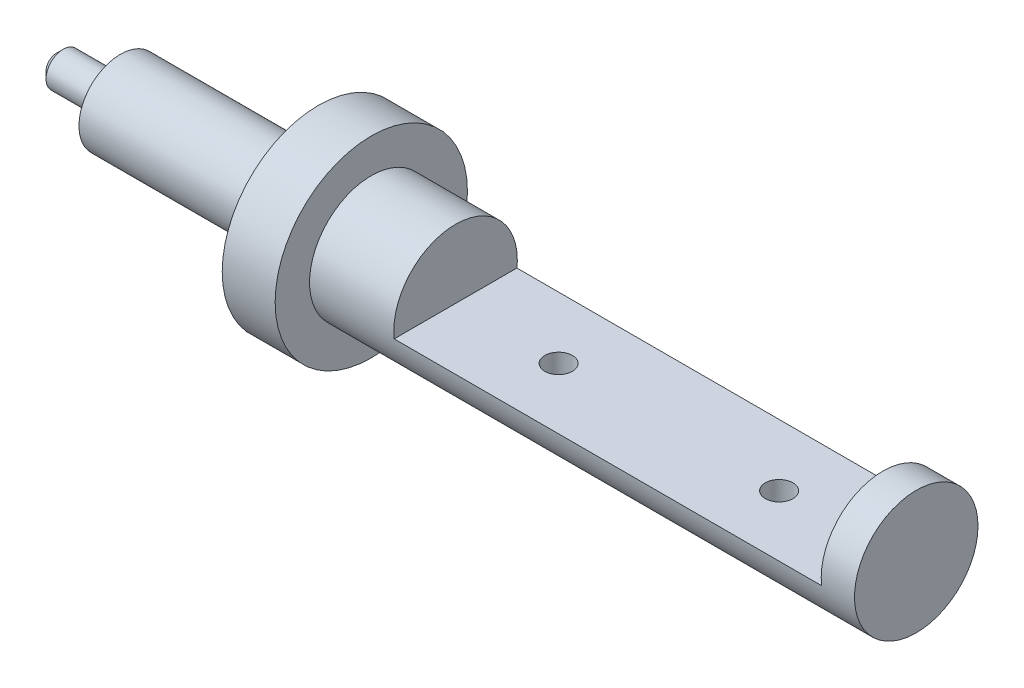
ISO-10303-21;
HEADER;
FILE_DESCRIPTION(('STEP AP214'),'2;1');
FILE_NAME('part.step','',(''),(''),'','','');
FILE_SCHEMA(('AUTOMOTIVE_DESIGN { 1 0 10303 214 1 1 1 1 }'));
ENDSEC;
DATA;
#1=APPLICATION_CONTEXT('core data for automotive mechanical design processes');
#2=APPLICATION_PROTOCOL_DEFINITION('international standard','automotive_design',2000,#1);
#3=PRODUCT_CONTEXT('',#1,'mechanical');
#4=PRODUCT('Part','Part','',(#3));
#5=PRODUCT_RELATED_PRODUCT_CATEGORY('part','',(#4));
#6=PRODUCT_DEFINITION_FORMATION('','',#4);
#7=PRODUCT_DEFINITION_CONTEXT('part definition',#1,'design');
#8=PRODUCT_DEFINITION('design','',#6,#7);
#9=PRODUCT_DEFINITION_SHAPE('','',#8);
#10=(LENGTH_UNIT() NAMED_UNIT(*) SI_UNIT(.MILLI.,.METRE.));
#11=(NAMED_UNIT(*) PLANE_ANGLE_UNIT() SI_UNIT($,.RADIAN.));
#12=(NAMED_UNIT(*) SI_UNIT($,.STERADIAN.) SOLID_ANGLE_UNIT());
#13=UNCERTAINTY_MEASURE_WITH_UNIT(LENGTH_MEASURE(1.E-05),#10,'distance_accuracy_value','');
#14=(GEOMETRIC_REPRESENTATION_CONTEXT(3) GLOBAL_UNCERTAINTY_ASSIGNED_CONTEXT((#13)) GLOBAL_UNIT_ASSIGNED_CONTEXT((#10,
#11,#12)) REPRESENTATION_CONTEXT('',''));
#15=CARTESIAN_POINT('',(0.,0.,0.));
#16=DIRECTION('',(0.,0.,1.));
#17=DIRECTION('',(1.,0.,0.));
#18=AXIS2_PLACEMENT_3D('',#15,#16,#17);
#19=CARTESIAN_POINT('',(0.,0.,0.));
#20=DIRECTION('',(1.,0.,0.));
#21=DIRECTION('',(0.,0.,-1.));
#22=AXIS2_PLACEMENT_3D('',#19,#20,#21);
#23=PLANE('',#22);
#24=CARTESIAN_POINT('',(0.,0.,0.));
#25=DIRECTION('',(1.,0.,0.));
#26=DIRECTION('',(0.,0.,-1.));
#27=AXIS2_PLACEMENT_3D('',#24,#25,#26);
#28=CIRCLE('',#27,28.);
#29=CARTESIAN_POINT('',(0.,0.,-28.));
#30=VERTEX_POINT('',#29);
#31=EDGE_CURVE('E66',#30,#30,#28,.T.);
#32=ORIENTED_EDGE('',*,*,#31,.T.);
#33=EDGE_LOOP('',(#32));
#34=FACE_BOUND('',#33,.T.);
#35=ADVANCED_FACE('F32',(#34),#23,.T.);
#36=CARTESIAN_POINT('',(0.,0.,0.));
#37=DIRECTION('',(1.,0.,0.));
#38=DIRECTION('',(0.,0.,-1.));
#39=AXIS2_PLACEMENT_3D('',#36,#37,#38);
#40=CYLINDRICAL_SURFACE('',#39,28.);
#41=CARTESIAN_POINT('',(-68.25,-27.9994708718922,0.172136265965393));
#42=CARTESIAN_POINT('',(-68.2500042082354,-28.0005376861227,-0.00101023386827139));
#43=CARTESIAN_POINT('',(-68.242803382548,-27.9999908422632,-0.174117278895013));
#44=CARTESIAN_POINT('',(-68.2140628191305,-27.9957177739289,-0.51914786458116));
#45=CARTESIAN_POINT('',(-68.1925210456606,-27.9919910980466,-0.691071233713084));
#46=CARTESIAN_POINT('',(-68.135251903922,-27.9814782602955,-1.03250877162111));
#47=CARTESIAN_POINT('',(-68.0995186671388,-27.9746908325742,-1.20202191363466));
#48=CARTESIAN_POINT('',(-68.0141361485952,-27.9582636204321,-1.53743171083578));
#49=CARTESIAN_POINT('',(-67.9644817543271,-27.9486227880337,-1.70332701321216));
#50=CARTESIAN_POINT('',(-67.8517283730067,-27.9267916590745,-2.0300441717831));
#51=CARTESIAN_POINT('',(-67.7886485146576,-27.9146049902922,-2.1908728765015));
#52=CARTESIAN_POINT('',(-67.6494519635598,-27.8880215877124,-2.50666552163221));
#53=CARTESIAN_POINT('',(-67.573330460207,-27.8736240386029,-2.661627272086));
#54=CARTESIAN_POINT('',(-67.4086547278412,-27.843037592331,-2.96452742810959));
#55=CARTESIAN_POINT('',(-67.3201055830421,-27.8268494282896,-3.11246867285119));
#56=CARTESIAN_POINT('',(-67.1311384090872,-27.7931243584982,-3.40048119366497));
#57=CARTESIAN_POINT('',(-67.0307159361624,-27.7755869486361,-3.54054949405018));
#58=CARTESIAN_POINT('',(-66.8172215451328,-27.7394035154323,-3.81375792091397));
#59=CARTESIAN_POINT('',(-66.70399177872,-27.7207453813054,-3.94677311502246));
#60=CARTESIAN_POINT('',(-66.4667850005088,-27.6830728715471,-4.20288473127593));
#61=CARTESIAN_POINT('',(-66.3428040220101,-27.6640583664768,-4.32597745989158));
#62=CARTESIAN_POINT('',(-66.0849950058863,-27.6262268269537,-4.56133727949786));
#63=CARTESIAN_POINT('',(-65.9511696836433,-27.6074097396708,-4.67360733613024));
#64=CARTESIAN_POINT('',(-65.6744788062795,-27.5704997765863,-4.88663855097));
#65=CARTESIAN_POINT('',(-65.531609931993,-27.5524071707082,-4.98739544510873));
#66=CARTESIAN_POINT('',(-65.2361113116915,-27.5172735556797,-5.17775413930525));
#67=CARTESIAN_POINT('',(-65.0833873010839,-27.5002472396865,-5.26721243145305));
#68=CARTESIAN_POINT('',(-64.7706992447927,-27.4679835926945,-5.43295575236734));
#69=CARTESIAN_POINT('',(-64.6107325031086,-27.4527469355824,-5.50923582400126));
#70=CARTESIAN_POINT('',(-64.2847835215166,-27.4245419681697,-5.64796645750356));
#71=CARTESIAN_POINT('',(-64.1188040896296,-27.4115726150774,-5.71042338052924));
#72=CARTESIAN_POINT('',(-63.7819778250143,-27.388286676047,-5.82107355783936));
#73=CARTESIAN_POINT('',(-63.6111292578269,-27.3779710488636,-5.8692616579405));
#74=CARTESIAN_POINT('',(-63.0982575653554,-27.3518030399038,-5.99049723241331));
#75=CARTESIAN_POINT('',(-62.7506388217803,-27.3402581684794,-6.04244996655398));
#76=CARTESIAN_POINT('',(-62.2268147337716,-27.3327562656231,-6.07621381865201));
#77=CARTESIAN_POINT('',(-62.0517372252014,-27.3318931447271,-6.08010030590699));
#78=CARTESIAN_POINT('',(-61.7018645427985,-27.3334279421475,-6.07319844263962));
#79=CARTESIAN_POINT('',(-61.5270693727703,-27.3358259040449,-6.06240989600005));
#80=CARTESIAN_POINT('',(-61.0114717503795,-27.347703286767,-6.00872296263676));
#81=CARTESIAN_POINT('',(-60.6727166907912,-27.3617756489615,-5.94492022186656));
#82=CARTESIAN_POINT('',(-60.0110135963371,-27.4006888086259,-5.76287574966961));
#83=CARTESIAN_POINT('',(-59.6880664576156,-27.4255302158033,-5.64463093588993));
#84=CARTESIAN_POINT('',(-59.0639888645885,-27.4833391855213,-5.35609908672192));
#85=CARTESIAN_POINT('',(-58.7630492861606,-27.5163689253155,-5.18541134017205));
#86=CARTESIAN_POINT('',(-58.193702705746,-27.5867097673151,-4.79710931419838));
#87=CARTESIAN_POINT('',(-57.9253001212518,-27.6240214495368,-4.57948867389659));
#88=CARTESIAN_POINT('',(-57.4226386230614,-27.6995855075514,-4.09798411226993));
#89=CARTESIAN_POINT('',(-57.1892280714162,-27.7378410017059,-3.83321405902169));
#90=CARTESIAN_POINT('',(-56.769987426921,-27.8101136102197,-3.26782378479838));
#91=CARTESIAN_POINT('',(-56.5841579189876,-27.844130672473,-2.96720312317616));
#92=CARTESIAN_POINT('',(-56.2652806253218,-27.9040201328542,-2.33785876409867));
#93=CARTESIAN_POINT('',(-56.1323040696628,-27.9298815299445,-2.00909786184459));
#94=CARTESIAN_POINT('',(-55.9236953917715,-27.9702884147525,-1.33320676502351));
#95=CARTESIAN_POINT('',(-55.8480546387895,-27.9848356056046,-0.986079343585231));
#96=CARTESIAN_POINT('',(-55.7575299454588,-28.0006029234157,-0.29091869001073));
#97=CARTESIAN_POINT('',(-55.7414369296985,-28.0020891147289,0.0569513115436337));
#98=CARTESIAN_POINT('',(-55.767141413028,-27.9920916828841,0.750338479247501));
#99=CARTESIAN_POINT('',(-55.8089352008109,-27.9806088912175,1.09585579480799));
#100=CARTESIAN_POINT('',(-55.9482619062834,-27.9459566692866,1.77107199583229));
#101=CARTESIAN_POINT('',(-56.0452137797024,-27.9229093556937,2.10089753840769));
#102=CARTESIAN_POINT('',(-56.2914152648986,-27.8675007967301,2.73957093697308));
#103=CARTESIAN_POINT('',(-56.4406697629316,-27.8351386811953,3.04841682976669));
#104=CARTESIAN_POINT('',(-56.7899392063809,-27.7637986090319,3.64173990692176));
#105=CARTESIAN_POINT('',(-56.9907184455222,-27.7247242570487,3.92575530739076));
#106=CARTESIAN_POINT('',(-57.436352178097,-27.6443821664083,4.4564910460546));
#107=CARTESIAN_POINT('',(-57.6812127693555,-27.6031141248528,4.70320621576707));
#108=CARTESIAN_POINT('',(-58.2136651327365,-27.5219451634807,5.15721274367252));
#109=CARTESIAN_POINT('',(-58.5019911329321,-27.4820860655088,5.36365025764069));
#110=CARTESIAN_POINT('',(-59.1102100375021,-27.4090545856138,5.72520351951389));
#111=CARTESIAN_POINT('',(-59.4301013465127,-27.3758818660075,5.88032185945308));
#112=CARTESIAN_POINT('',(-59.9252921336632,-27.3341289974433,6.07037621419459));
#113=CARTESIAN_POINT('',(-60.0924090274806,-27.3215706377702,6.12652227706785));
#114=CARTESIAN_POINT('',(-60.4309529635877,-27.299407683175,6.22453950913016));
#115=CARTESIAN_POINT('',(-60.6023783676466,-27.2898019834032,6.26641601845254));
#116=CARTESIAN_POINT('',(-60.948300171353,-27.2738368617317,6.33554081282223));
#117=CARTESIAN_POINT('',(-61.1227967212094,-27.2674775990732,6.36278838030747));
#118=CARTESIAN_POINT('',(-61.4735581628209,-27.2581981719102,6.40242535545471));
#119=CARTESIAN_POINT('',(-61.6498229797174,-27.2552778624339,6.41481538944818));
#120=CARTESIAN_POINT('',(-61.9985493535204,-27.2529939224183,6.42451119569068));
#121=CARTESIAN_POINT('',(-62.1710006125645,-27.2535465788029,6.42217200148897));
#122=CARTESIAN_POINT('',(-62.5150745299726,-27.257996564982,6.40325836530848));
#123=CARTESIAN_POINT('',(-62.6866972054486,-27.2618938254038,6.38668421858576));
#124=CARTESIAN_POINT('',(-63.0279115816516,-27.2729198315057,6.33943456938637));
#125=CARTESIAN_POINT('',(-63.1975029513947,-27.2800490966546,6.30875680007278));
#126=CARTESIAN_POINT('',(-63.53336742776,-27.2973292253791,6.23356258271536));
#127=CARTESIAN_POINT('',(-63.6996416866205,-27.3074790195268,6.18905103231902));
#128=CARTESIAN_POINT('',(-64.0271856378125,-27.3304687884478,6.08672427488614));
#129=CARTESIAN_POINT('',(-64.1884712982983,-27.3432988695394,6.02895791994158));
#130=CARTESIAN_POINT('',(-64.505527795996,-27.3713078283775,5.90049361388031));
#131=CARTESIAN_POINT('',(-64.6613005388256,-27.3864858845741,5.82980018434137));
#132=CARTESIAN_POINT('',(-64.9664372614379,-27.4187851159887,5.6759492775293));
#133=CARTESIAN_POINT('',(-65.1157984301258,-27.4359071317648,5.59278640351014));
#134=CARTESIAN_POINT('',(-65.4070330163757,-27.4716219546193,5.41463153317887));
#135=CARTESIAN_POINT('',(-65.5489089167867,-27.4902142688237,5.31964349482265));
#136=CARTESIAN_POINT('',(-65.827425932691,-27.5288123034981,5.11619476310646));
#137=CARTESIAN_POINT('',(-65.9638780780076,-27.5488403815457,5.00747952772605));
#138=CARTESIAN_POINT('',(-66.2271344673098,-27.5893741663132,4.77910805324866));
#139=CARTESIAN_POINT('',(-66.3539420185481,-27.6098797061263,4.65945559593568));
#140=CARTESIAN_POINT('',(-66.5972003816087,-27.6508370353703,4.40989858272825));
#141=CARTESIAN_POINT('',(-66.7136449798919,-27.6712887855128,4.27998796305098));
#142=CARTESIAN_POINT('',(-66.9352714100457,-27.7115738473761,4.01088211145195));
#143=CARTESIAN_POINT('',(-67.0404573371489,-27.7314073820935,3.87169028558349));
#144=CARTESIAN_POINT('',(-67.2404177254107,-27.7702343715822,3.58268878890566));
#145=CARTESIAN_POINT('',(-67.3350075532179,-27.7892102543749,3.43274891547145));
#146=CARTESIAN_POINT('',(-67.5111549239003,-27.8254664605984,3.1252792861318));
#147=CARTESIAN_POINT('',(-67.592717252305,-27.8427474057441,2.96775234506893));
#148=CARTESIAN_POINT('',(-67.7421927430361,-27.8751422725748,2.64622752380721));
#149=CARTESIAN_POINT('',(-67.810113057833,-27.890257328632,2.48223308874137));
#150=CARTESIAN_POINT('',(-67.9318044801668,-27.9179176211319,2.14892322102304));
#151=CARTESIAN_POINT('',(-67.9855780451743,-27.9304633038237,1.97960871826213));
#152=CARTESIAN_POINT('',(-68.1041773954086,-27.9587577256315,1.54229414348332));
#153=CARTESIAN_POINT('',(-68.1587723865492,-27.9724635997722,1.27131300247472));
#154=CARTESIAN_POINT('',(-68.2316794086969,-27.9919697116723,0.724233071573435));
#155=CARTESIAN_POINT('',(-68.2499932920057,-27.9977703530221,0.448134543671111));
#156=CARTESIAN_POINT('',(-68.25,-27.9994708718922,0.172136265965393));
#157=B_SPLINE_CURVE_WITH_KNOTS('',3,(#41,#42,#43,#44,#45,#46,#47,#48,#49,#50,#51,#52,#53,#54,
#55,#56,#57,#58,#59,#60,#61,#62,#63,#64,#65,#66,#67,#68,#69,#70,#71,#72,#73,#74,#75,#76,#77,#78,
#79,#80,#81,#82,#83,#84,#85,#86,#87,#88,#89,#90,#91,#92,#93,#94,#95,#96,#97,#98,#99,#100,#101,
#102,#103,#104,#105,#106,#107,#108,#109,#110,#111,#112,#113,#114,#115,#116,#117,#118,#119,#120,
#121,#122,#123,#124,#125,#126,#127,#128,#129,#130,#131,#132,#133,#134,#135,#136,#137,#138,#139,
#140,#141,#142,#143,#144,#145,#146,#147,#148,#149,#150,#151,#152,#153,#154,#155,#156),
.UNSPECIFIED.,.T.,.F.,(4,2,2,2,2,2,2,2,2,2,2,2,2,2,2,2,2,2,2,2,2,2,2,2,2,2,2,2,2,2,2,2,2,2,2,2,
2,2,2,2,2,2,2,2,2,2,2,2,2,2,2,2,2,2,2,2,2,4),(0.,0.519207185123345,1.03848808896031,
1.55798395201615,2.07767084900782,2.59662219068659,3.11576536902502,3.63469677889979,
4.15382302502026,4.68024020863341,5.20685244900949,5.73331997380224,6.25998185587071,
6.79277451539491,7.32576715641455,7.85851401173108,8.39145307173233,9.44031770004659,
9.96516791421687,10.4900251425569,11.5197434178831,12.5495200000541,13.5873693767635,
14.6253595030858,15.6854435658268,16.7455406596203,17.8070616438566,18.8684228057463,
19.9081116774897,20.9477338945601,21.976602133696,23.0055665181836,24.0507782280493,
25.0961346345243,26.1616891778097,27.2271898937367,27.7568826971959,28.2863770540287,
28.8158973806389,29.345395384102,29.8621800296706,30.3789539565444,30.8958109721411,
31.4124852101318,31.9272849332258,32.4419049350734,32.9567483095881,33.4714198238102,
33.997643205294,34.5236853168738,35.050040743212,35.5762040575366,36.1104452584975,
36.6444897573767,37.1782535230583,37.7119245058571,38.539591283081,39.3672158033811),.UNSPECIFIED.);
#158=CARTESIAN_POINT('',(-68.25,-27.9994708718922,0.172136265965393));
#159=VERTEX_POINT('',#158);
#160=EDGE_CURVE('E107',#159,#159,#157,.T.);
#161=ORIENTED_EDGE('',*,*,#160,.F.);
#162=EDGE_LOOP('',(#161));
#163=FACE_BOUND('',#162,.T.);
#164=CARTESIAN_POINT('',(-168.25,-27.9994708718922,0.172136265965406));
#165=CARTESIAN_POINT('',(-168.250004208235,-28.0005376861227,-0.00101023386825735));
#166=CARTESIAN_POINT('',(-168.242803382548,-27.9999908422632,-0.174117278894999));
#167=CARTESIAN_POINT('',(-168.214062819131,-27.9957177739289,-0.519147864581144));
#168=CARTESIAN_POINT('',(-168.192521045661,-27.9919910980466,-0.691071233713068));
#169=CARTESIAN_POINT('',(-168.135251903922,-27.9814782602955,-1.03250877162109));
#170=CARTESIAN_POINT('',(-168.099518667139,-27.9746908325742,-1.20202191363465));
#171=CARTESIAN_POINT('',(-168.014136148595,-27.9582636204321,-1.53743171083576));
#172=CARTESIAN_POINT('',(-167.964481754327,-27.9486227880337,-1.70332701321215));
#173=CARTESIAN_POINT('',(-167.851728373007,-27.9267916590745,-2.03004417178309));
#174=CARTESIAN_POINT('',(-167.788648514658,-27.9146049902922,-2.19087287650148));
#175=CARTESIAN_POINT('',(-167.64945196356,-27.8880215877124,-2.5066655216322));
#176=CARTESIAN_POINT('',(-167.573330460207,-27.8736240386029,-2.66162727208599));
#177=CARTESIAN_POINT('',(-167.408654727841,-27.843037592331,-2.96452742810958));
#178=CARTESIAN_POINT('',(-167.320105583042,-27.8268494282896,-3.11246867285118));
#179=CARTESIAN_POINT('',(-167.131138409087,-27.7931243584982,-3.40048119366496));
#180=CARTESIAN_POINT('',(-167.030715936162,-27.7755869486361,-3.54054949405017));
#181=CARTESIAN_POINT('',(-166.817221545133,-27.7394035154323,-3.81375792091397));
#182=CARTESIAN_POINT('',(-166.70399177872,-27.7207453813054,-3.94677311502245));
#183=CARTESIAN_POINT('',(-166.466785000509,-27.6830728715471,-4.20288473127593));
#184=CARTESIAN_POINT('',(-166.34280402201,-27.6640583664768,-4.32597745989158));
#185=CARTESIAN_POINT('',(-166.084995005886,-27.6262268269537,-4.56133727949786));
#186=CARTESIAN_POINT('',(-165.951169683643,-27.6074097396708,-4.67360733613024));
#187=CARTESIAN_POINT('',(-165.674478806279,-27.5704997765863,-4.88663855097));
#188=CARTESIAN_POINT('',(-165.531609931993,-27.5524071707082,-4.98739544510873));
#189=CARTESIAN_POINT('',(-165.236111311692,-27.5172735556797,-5.17775413930525));
#190=CARTESIAN_POINT('',(-165.083387301084,-27.5002472396865,-5.26721243145304));
#191=CARTESIAN_POINT('',(-164.770699244793,-27.4679835926945,-5.43295575236732));
#192=CARTESIAN_POINT('',(-164.610732503109,-27.4527469355824,-5.50923582400123));
#193=CARTESIAN_POINT('',(-164.284783521517,-27.4245419681697,-5.64796645750354));
#194=CARTESIAN_POINT('',(-164.11880408963,-27.4115726150775,-5.71042338052922));
#195=CARTESIAN_POINT('',(-163.781977825014,-27.388286676047,-5.82107355783935));
#196=CARTESIAN_POINT('',(-163.611129257827,-27.3779710488636,-5.86926165794048));
#197=CARTESIAN_POINT('',(-163.098257565355,-27.3518030399038,-5.9904972324133));
#198=CARTESIAN_POINT('',(-162.75063882178,-27.3402581684794,-6.04244996655397));
#199=CARTESIAN_POINT('',(-162.226814733772,-27.3327562656231,-6.076213818652));
#200=CARTESIAN_POINT('',(-162.051737225201,-27.3318931447271,-6.08010030590698));
#201=CARTESIAN_POINT('',(-161.701864542799,-27.3334279421475,-6.07319844263961));
#202=CARTESIAN_POINT('',(-161.52706937277,-27.3358259040449,-6.06240989600004));
#203=CARTESIAN_POINT('',(-161.01147175038,-27.347703286767,-6.00872296263675));
#204=CARTESIAN_POINT('',(-160.672716690791,-27.3617756489615,-5.94492022186655));
#205=CARTESIAN_POINT('',(-160.011013596337,-27.4006888086259,-5.76287574966959));
#206=CARTESIAN_POINT('',(-159.688066457616,-27.4255302158033,-5.64463093588992));
#207=CARTESIAN_POINT('',(-159.063988864589,-27.4833391855213,-5.35609908672189));
#208=CARTESIAN_POINT('',(-158.763049286161,-27.5163689253155,-5.18541134017202));
#209=CARTESIAN_POINT('',(-158.193702705746,-27.5867097673151,-4.79710931419835));
#210=CARTESIAN_POINT('',(-157.925300121252,-27.6240214495368,-4.57948867389656));
#211=CARTESIAN_POINT('',(-157.422638623061,-27.6995855075514,-4.0979841122699));
#212=CARTESIAN_POINT('',(-157.189228071416,-27.7378410017059,-3.83321405902167));
#213=CARTESIAN_POINT('',(-156.769987426921,-27.8101136102197,-3.26782378479836));
#214=CARTESIAN_POINT('',(-156.584157918988,-27.844130672473,-2.96720312317613));
#215=CARTESIAN_POINT('',(-156.265280625322,-27.9040201328542,-2.33785876409864));
#216=CARTESIAN_POINT('',(-156.132304069663,-27.9298815299445,-2.00909786184455));
#217=CARTESIAN_POINT('',(-155.923695391772,-27.9702884147525,-1.33320676502348));
#218=CARTESIAN_POINT('',(-155.848054638789,-27.9848356056046,-0.986079343585205));
#219=CARTESIAN_POINT('',(-155.757529945459,-28.0006029234157,-0.290918690010709));
#220=CARTESIAN_POINT('',(-155.741436929698,-28.0020891147289,0.0569513115436546));
#221=CARTESIAN_POINT('',(-155.767141413028,-27.9920916828841,0.750338479247519));
#222=CARTESIAN_POINT('',(-155.808935200811,-27.9806088912175,1.09585579480801));
#223=CARTESIAN_POINT('',(-155.948261906283,-27.9459566692866,1.7710719958323));
#224=CARTESIAN_POINT('',(-156.045213779702,-27.9229093556937,2.10089753840771));
#225=CARTESIAN_POINT('',(-156.291415264899,-27.8675007967301,2.7395709369731));
#226=CARTESIAN_POINT('',(-156.440669762932,-27.8351386811953,3.04841682976671));
#227=CARTESIAN_POINT('',(-156.789939206381,-27.7637986090319,3.64173990692177));
#228=CARTESIAN_POINT('',(-156.990718445522,-27.7247242570487,3.92575530739077));
#229=CARTESIAN_POINT('',(-157.436352178097,-27.6443821664083,4.45649104605461));
#230=CARTESIAN_POINT('',(-157.681212769356,-27.6031141248528,4.70320621576709));
#231=CARTESIAN_POINT('',(-158.213665132737,-27.5219451634807,5.15721274367254));
#232=CARTESIAN_POINT('',(-158.501991132932,-27.4820860655088,5.36365025764071));
#233=CARTESIAN_POINT('',(-159.110210037502,-27.4090545856138,5.72520351951392));
#234=CARTESIAN_POINT('',(-159.430101346513,-27.3758818660075,5.8803218594531));
#235=CARTESIAN_POINT('',(-159.925292133663,-27.3341289974433,6.0703762141946));
#236=CARTESIAN_POINT('',(-160.092409027481,-27.3215706377701,6.12652227706786));
#237=CARTESIAN_POINT('',(-160.430952963588,-27.299407683175,6.22453950913017));
#238=CARTESIAN_POINT('',(-160.602378367647,-27.2898019834032,6.26641601845256));
#239=CARTESIAN_POINT('',(-160.948300171353,-27.2738368617317,6.33554081282225));
#240=CARTESIAN_POINT('',(-161.122796721209,-27.2674775990732,6.36278838030749));
#241=CARTESIAN_POINT('',(-161.473558162821,-27.2581981719102,6.40242535545472));
#242=CARTESIAN_POINT('',(-161.649822979717,-27.2552778624339,6.41481538944819));
#243=CARTESIAN_POINT('',(-161.99854935352,-27.2529939224183,6.42451119569069));
#244=CARTESIAN_POINT('',(-162.171000612565,-27.2535465788029,6.42217200148898));
#245=CARTESIAN_POINT('',(-162.515074529973,-27.257996564982,6.40325836530849));
#246=CARTESIAN_POINT('',(-162.686697205449,-27.2618938254038,6.38668421858577));
#247=CARTESIAN_POINT('',(-163.027911581652,-27.2729198315057,6.33943456938638));
#248=CARTESIAN_POINT('',(-163.197502951395,-27.2800490966546,6.30875680007279));
#249=CARTESIAN_POINT('',(-163.53336742776,-27.2973292253791,6.23356258271537));
#250=CARTESIAN_POINT('',(-163.699641686621,-27.3074790195268,6.18905103231902));
#251=CARTESIAN_POINT('',(-164.027185637813,-27.3304687884478,6.08672427488615));
#252=CARTESIAN_POINT('',(-164.188471298298,-27.3432988695394,6.02895791994158));
#253=CARTESIAN_POINT('',(-164.505527795996,-27.3713078283775,5.90049361388031));
#254=CARTESIAN_POINT('',(-164.661300538826,-27.3864858845741,5.82980018434137));
#255=CARTESIAN_POINT('',(-164.966437261438,-27.4187851159887,5.6759492775293));
#256=CARTESIAN_POINT('',(-165.115798430126,-27.4359071317648,5.59278640351013));
#257=CARTESIAN_POINT('',(-165.407033016376,-27.4716219546193,5.41463153317886));
#258=CARTESIAN_POINT('',(-165.548908916787,-27.4902142688237,5.31964349482266));
#259=CARTESIAN_POINT('',(-165.827425932691,-27.5288123034981,5.11619476310648));
#260=CARTESIAN_POINT('',(-165.963878078008,-27.5488403815457,5.00747952772606));
#261=CARTESIAN_POINT('',(-166.22713446731,-27.5893741663132,4.77910805324868));
#262=CARTESIAN_POINT('',(-166.353942018548,-27.6098797061263,4.65945559593569));
#263=CARTESIAN_POINT('',(-166.597200381609,-27.6508370353703,4.40989858272825));
#264=CARTESIAN_POINT('',(-166.713644979892,-27.6712887855128,4.27998796305097));
#265=CARTESIAN_POINT('',(-166.935271410046,-27.7115738473761,4.01088211145194));
#266=CARTESIAN_POINT('',(-167.040457337149,-27.7314073820935,3.87169028558349));
#267=CARTESIAN_POINT('',(-167.240417725411,-27.7702343715822,3.58268878890567));
#268=CARTESIAN_POINT('',(-167.335007553218,-27.7892102543749,3.43274891547146));
#269=CARTESIAN_POINT('',(-167.5111549239,-27.8254664605984,3.1252792861318));
#270=CARTESIAN_POINT('',(-167.592717252305,-27.8427474057441,2.96775234506893));
#271=CARTESIAN_POINT('',(-167.742192743036,-27.8751422725748,2.64622752380722));
#272=CARTESIAN_POINT('',(-167.810113057833,-27.890257328632,2.48223308874138));
#273=CARTESIAN_POINT('',(-167.931804480167,-27.9179176211319,2.14892322102305));
#274=CARTESIAN_POINT('',(-167.985578045174,-27.9304633038237,1.97960871826215));
#275=CARTESIAN_POINT('',(-168.104177395409,-27.9587577256315,1.54229414348333));
#276=CARTESIAN_POINT('',(-168.158772386549,-27.9724635997722,1.27131300247474));
#277=CARTESIAN_POINT('',(-168.231679408697,-27.9919697116723,0.724233071573447));
#278=CARTESIAN_POINT('',(-168.249993292006,-27.9977703530221,0.448134543671124));
#279=CARTESIAN_POINT('',(-168.25,-27.9994708718922,0.172136265965406));
#280=B_SPLINE_CURVE_WITH_KNOTS('',3,(#164,#165,#166,#167,#168,#169,#170,#171,#172,#173,#174,
#175,#176,#177,#178,#179,#180,#181,#182,#183,#184,#185,#186,#187,#188,#189,#190,#191,#192,#193,
#194,#195,#196,#197,#198,#199,#200,#201,#202,#203,#204,#205,#206,#207,#208,#209,#210,#211,#212,
#213,#214,#215,#216,#217,#218,#219,#220,#221,#222,#223,#224,#225,#226,#227,#228,#229,#230,#231,
#232,#233,#234,#235,#236,#237,#238,#239,#240,#241,#242,#243,#244,#245,#246,#247,#248,#249,#250,
#251,#252,#253,#254,#255,#256,#257,#258,#259,#260,#261,#262,#263,#264,#265,#266,#267,#268,#269,
#270,#271,#272,#273,#274,#275,#276,#277,#278,#279),.UNSPECIFIED.,.T.,.F.,(4,2,2,2,2,2,2,2,2,2,2,
2,2,2,2,2,2,2,2,2,2,2,2,2,2,2,2,2,2,2,2,2,2,2,2,2,2,2,2,2,2,2,2,2,2,2,2,2,2,2,2,2,2,2,2,2,2,4),
(0.,0.519207185123343,1.0384880889603,1.55798395201615,2.07767084900783,2.59662219068659,
3.11576536902502,3.63469677889981,4.15382302502026,4.68024020863343,5.20685244900951,
5.73331997380228,6.25998185587072,6.79277451539489,7.32576715641454,7.85851401173108,
8.39145307173231,9.44031770004655,9.96516791421684,10.4900251425569,11.5197434178831,
12.5495200000542,13.5873693767635,14.6253595030859,15.6854435658268,16.7455406596203,
17.8070616438567,18.8684228057463,19.9081116774897,20.9477338945601,21.976602133696,
23.0055665181836,24.0507782280493,25.0961346345243,26.1616891778097,27.2271898937367,
27.7568826971958,28.2863770540288,28.8158973806389,29.345395384102,29.8621800296706,
30.3789539565444,30.8958109721411,31.4124852101318,31.9272849332258,32.4419049350735,
32.9567483095881,33.4714198238102,33.997643205294,34.5236853168738,35.0500407432121,
35.5762040575366,36.1104452584975,36.6444897573767,37.1782535230583,37.7119245058571,
38.539591283081,39.3672158033811),.UNSPECIFIED.);
#281=CARTESIAN_POINT('',(-168.25,-27.9994708718922,0.172136265965406));
#282=VERTEX_POINT('',#281);
#283=EDGE_CURVE('E73',#282,#282,#280,.T.);
#284=ORIENTED_EDGE('',*,*,#283,.F.);
#285=EDGE_LOOP('',(#284));
#286=FACE_BOUND('',#285,.T.);
#287=DIRECTION('',(1.,0.,0.));
#288=VECTOR('',#287,1.);
#289=CARTESIAN_POINT('',(0.,-3.10000000000002,-27.8278637340346));
#290=LINE('',#289,#288);
#291=CARTESIAN_POINT('',(-15.1,-3.10000000000002,-27.8278637340346));
#292=VERTEX_POINT('',#291);
#293=CARTESIAN_POINT('',(-208.9,-3.10000000000004,-27.8278637340346));
#294=VERTEX_POINT('',#293);
#295=EDGE_CURVE('E40',#292,#294,#290,.F.);
#296=ORIENTED_EDGE('',*,*,#295,.F.);
#297=CARTESIAN_POINT('',(-15.1,0.,0.));
#298=DIRECTION('',(1.,0.,0.));
#299=DIRECTION('',(0.,1.,0.));
#300=AXIS2_PLACEMENT_3D('',#297,#298,#299);
#301=CIRCLE('',#300,28.);
#302=CARTESIAN_POINT('',(-15.1,-3.10000000000002,27.8278637340346));
#303=VERTEX_POINT('',#302);
#304=EDGE_CURVE('E11',#303,#292,#301,.F.);
#305=ORIENTED_EDGE('',*,*,#304,.F.);
#306=DIRECTION('',(1.,0.,0.));
#307=VECTOR('',#306,1.);
#308=CARTESIAN_POINT('',(0.,-3.10000000000002,27.8278637340346));
#309=LINE('',#308,#307);
#310=CARTESIAN_POINT('',(-208.9,-3.10000000000004,27.8278637340346));
#311=VERTEX_POINT('',#310);
#312=EDGE_CURVE('E48',#311,#303,#309,.T.);
#313=ORIENTED_EDGE('',*,*,#312,.F.);
#314=CARTESIAN_POINT('',(-208.9,0.,0.));
#315=DIRECTION('',(-1.,0.,0.));
#316=DIRECTION('',(0.,0.,1.));
#317=AXIS2_PLACEMENT_3D('',#314,#315,#316);
#318=CIRCLE('',#317,28.);
#319=EDGE_CURVE('E60',#294,#311,#318,.F.);
#320=ORIENTED_EDGE('',*,*,#319,.F.);
#321=EDGE_LOOP('',(#296,#305,#313,#320));
#322=FACE_BOUND('',#321,.T.);
#323=CARTESIAN_POINT('',(-247.1,0.,0.));
#324=DIRECTION('',(1.,0.,0.));
#325=DIRECTION('',(0.,0.,-1.));
#326=AXIS2_PLACEMENT_3D('',#323,#324,#325);
#327=CIRCLE('',#326,28.);
#328=CARTESIAN_POINT('',(-247.1,0.,-28.));
#329=VERTEX_POINT('',#328);
#330=EDGE_CURVE('E101',#329,#329,#327,.T.);
#331=ORIENTED_EDGE('',*,*,#330,.T.);
#332=EDGE_LOOP('',(#331));
#333=FACE_BOUND('',#332,.T.);
#334=ORIENTED_EDGE('',*,*,#31,.F.);
#335=EDGE_LOOP('',(#334));
#336=FACE_BOUND('',#335,.T.);
#337=ADVANCED_FACE('F62',(#163,#286,#322,#333,#336),#40,.T.);
#338=CARTESIAN_POINT('',(-247.1,28.,0.));
#339=DIRECTION('',(1.,0.,0.));
#340=DIRECTION('',(0.,0.,-1.));
#341=AXIS2_PLACEMENT_3D('',#338,#339,#340);
#342=PLANE('',#341);
#343=CARTESIAN_POINT('',(-247.1,0.,0.));
#344=DIRECTION('',(1.,0.,0.));
#345=DIRECTION('',(0.,0.,-1.));
#346=AXIS2_PLACEMENT_3D('',#343,#344,#345);
#347=CIRCLE('',#346,43.6);
#348=CARTESIAN_POINT('',(-247.1,0.,-43.6));
#349=VERTEX_POINT('',#348);
#350=EDGE_CURVE('E98',#349,#349,#347,.T.);
#351=ORIENTED_EDGE('',*,*,#350,.T.);
#352=EDGE_LOOP('',(#351));
#353=FACE_BOUND('',#352,.T.);
#354=ORIENTED_EDGE('',*,*,#330,.F.);
#355=EDGE_LOOP('',(#354));
#356=FACE_BOUND('',#355,.T.);
#357=ADVANCED_FACE('F165',(#353,#356),#342,.T.);
#358=CARTESIAN_POINT('',(0.,0.,0.));
#359=DIRECTION('',(1.,0.,0.));
#360=DIRECTION('',(0.,0.,-1.));
#361=AXIS2_PLACEMENT_3D('',#358,#359,#360);
#362=CYLINDRICAL_SURFACE('',#361,43.6);
#363=CARTESIAN_POINT('',(-271.1,0.,0.));
#364=DIRECTION('',(1.,0.,0.));
#365=DIRECTION('',(0.,0.,-1.));
#366=AXIS2_PLACEMENT_3D('',#363,#364,#365);
#367=CIRCLE('',#366,43.6);
#368=CARTESIAN_POINT('',(-271.1,0.,-43.6));
#369=VERTEX_POINT('',#368);
#370=EDGE_CURVE('E95',#369,#369,#367,.T.);
#371=ORIENTED_EDGE('',*,*,#370,.T.);
#372=EDGE_LOOP('',(#371));
#373=FACE_BOUND('',#372,.T.);
#374=ORIENTED_EDGE('',*,*,#350,.F.);
#375=EDGE_LOOP('',(#374));
#376=FACE_BOUND('',#375,.T.);
#377=ADVANCED_FACE('F162',(#373,#376),#362,.T.);
#378=CARTESIAN_POINT('',(-271.1,43.6,0.));
#379=DIRECTION('',(-1.,0.,0.));
#380=DIRECTION('',(0.,0.,1.));
#381=AXIS2_PLACEMENT_3D('',#378,#379,#380);
#382=PLANE('',#381);
#383=CARTESIAN_POINT('',(-271.1,0.,0.));
#384=DIRECTION('',(1.,0.,0.));
#385=DIRECTION('',(0.,0.,-1.));
#386=AXIS2_PLACEMENT_3D('',#383,#384,#385);
#387=CIRCLE('',#386,18.7499999999999);
#388=CARTESIAN_POINT('',(-271.1,0.,-18.7499999999999));
#389=VERTEX_POINT('',#388);
#390=EDGE_CURVE('E92',#389,#389,#387,.T.);
#391=ORIENTED_EDGE('',*,*,#390,.T.);
#392=EDGE_LOOP('',(#391));
#393=FACE_BOUND('',#392,.T.);
#394=ORIENTED_EDGE('',*,*,#370,.F.);
#395=EDGE_LOOP('',(#394));
#396=FACE_BOUND('',#395,.T.);
#397=ADVANCED_FACE('F158',(#393,#396),#382,.T.);
#398=CARTESIAN_POINT('',(0.,0.,0.));
#399=DIRECTION('',(1.,0.,0.));
#400=DIRECTION('',(0.,0.,-1.));
#401=AXIS2_PLACEMENT_3D('',#398,#399,#400);
#402=CYLINDRICAL_SURFACE('',#401,18.7499999999999);
#403=CARTESIAN_POINT('',(-360.9,0.,0.));
#404=DIRECTION('',(1.,0.,0.));
#405=DIRECTION('',(0.,0.,-1.));
#406=AXIS2_PLACEMENT_3D('',#403,#404,#405);
#407=CIRCLE('',#406,18.75);
#408=CARTESIAN_POINT('',(-360.9,0.,-18.75));
#409=VERTEX_POINT('',#408);
#410=EDGE_CURVE('E89',#409,#409,#407,.T.);
#411=ORIENTED_EDGE('',*,*,#410,.T.);
#412=EDGE_LOOP('',(#411));
#413=FACE_BOUND('',#412,.T.);
#414=ORIENTED_EDGE('',*,*,#390,.F.);
#415=EDGE_LOOP('',(#414));
#416=FACE_BOUND('',#415,.T.);
#417=ADVANCED_FACE('F154',(#413,#416),#402,.T.);
#418=CARTESIAN_POINT('',(-360.9,18.75,0.));
#419=DIRECTION('',(-1.,0.,0.));
#420=DIRECTION('',(0.,0.,1.));
#421=AXIS2_PLACEMENT_3D('',#418,#419,#420);
#422=PLANE('',#421);
#423=CARTESIAN_POINT('',(-360.9,0.,0.));
#424=DIRECTION('',(1.,0.,0.));
#425=DIRECTION('',(0.,0.,-1.));
#426=AXIS2_PLACEMENT_3D('',#423,#424,#425);
#427=CIRCLE('',#426,7.79645303867444);
#428=CARTESIAN_POINT('',(-360.9,0.,-7.79645303867444));
#429=VERTEX_POINT('',#428);
#430=EDGE_CURVE('E86',#429,#429,#427,.T.);
#431=ORIENTED_EDGE('',*,*,#430,.T.);
#432=EDGE_LOOP('',(#431));
#433=FACE_BOUND('',#432,.T.);
#434=ORIENTED_EDGE('',*,*,#410,.F.);
#435=EDGE_LOOP('',(#434));
#436=FACE_BOUND('',#435,.T.);
#437=ADVANCED_FACE('F150',(#433,#436),#422,.T.);
#438=CARTESIAN_POINT('',(0.,0.,0.));
#439=DIRECTION('',(1.,0.,0.));
#440=DIRECTION('',(0.,0.,-1.));
#441=AXIS2_PLACEMENT_3D('',#438,#439,#440);
#442=CYLINDRICAL_SURFACE('',#441,7.79645303867444);
#443=CARTESIAN_POINT('',(-386.8,0.,0.));
#444=DIRECTION('',(1.,0.,0.));
#445=DIRECTION('',(0.,0.,-1.));
#446=AXIS2_PLACEMENT_3D('',#443,#444,#445);
#447=CIRCLE('',#446,7.79645303867444);
#448=CARTESIAN_POINT('',(-386.8,0.,-7.79645303867444));
#449=VERTEX_POINT('',#448);
#450=EDGE_CURVE('E83',#449,#449,#447,.T.);
#451=ORIENTED_EDGE('',*,*,#450,.T.);
#452=EDGE_LOOP('',(#451));
#453=FACE_BOUND('',#452,.T.);
#454=ORIENTED_EDGE('',*,*,#430,.F.);
#455=EDGE_LOOP('',(#454));
#456=FACE_BOUND('',#455,.T.);
#457=ADVANCED_FACE('F146',(#453,#456),#442,.T.);
#458=CARTESIAN_POINT('',(-386.8,0.,0.));
#459=DIRECTION('',(1.,0.,0.));
#460=DIRECTION('',(0.,0.,-1.));
#461=AXIS2_PLACEMENT_3D('',#458,#459,#460);
#462=CONICAL_SURFACE('',#461,7.79645303867444,0.785398163397447);
#463=CARTESIAN_POINT('',(-389.8,0.,0.));
#464=DIRECTION('',(1.,0.,0.));
#465=DIRECTION('',(0.,0.,-1.));
#466=AXIS2_PLACEMENT_3D('',#463,#464,#465);
#467=CIRCLE('',#466,4.79645303867444);
#468=CARTESIAN_POINT('',(-389.8,0.,-4.79645303867444));
#469=VERTEX_POINT('',#468);
#470=EDGE_CURVE('E75',#469,#469,#467,.T.);
#471=ORIENTED_EDGE('',*,*,#470,.T.);
#472=EDGE_LOOP('',(#471));
#473=FACE_BOUND('',#472,.T.);
#474=ORIENTED_EDGE('',*,*,#450,.F.);
#475=EDGE_LOOP('',(#474));
#476=FACE_BOUND('',#475,.T.);
#477=ADVANCED_FACE('F142',(#473,#476),#462,.T.);
#478=CARTESIAN_POINT('',(-389.800000000002,4.79645303867444,0.));
#479=DIRECTION('',(-1.,0.,0.));
#480=DIRECTION('',(0.,0.,1.));
#481=AXIS2_PLACEMENT_3D('',#478,#479,#480);
#482=PLANE('',#481);
#483=ORIENTED_EDGE('',*,*,#470,.F.);
#484=EDGE_LOOP('',(#483));
#485=FACE_BOUND('',#484,.T.);
#486=ADVANCED_FACE('F134',(#485),#482,.T.);
#487=CARTESIAN_POINT('',(-15.1,28.,-43.6));
#488=DIRECTION('',(1.,0.,0.));
#489=DIRECTION('',(0.,1.,0.));
#490=AXIS2_PLACEMENT_3D('',#487,#488,#489);
#491=PLANE('',#490);
#492=ORIENTED_EDGE('',*,*,#304,.T.);
#493=DIRECTION('',(0.,0.,1.));
#494=VECTOR('',#493,1.);
#495=CARTESIAN_POINT('',(-15.1,-3.10000000000002,-43.6));
#496=LINE('',#495,#494);
#497=EDGE_CURVE('E70',#292,#303,#496,.T.);
#498=ORIENTED_EDGE('',*,*,#497,.T.);
#499=EDGE_LOOP('',(#492,#498));
#500=FACE_BOUND('',#499,.T.);
#501=ADVANCED_FACE('F131',(#500),#491,.F.);
#502=CARTESIAN_POINT('',(-15.1,-3.10000000000002,-43.6));
#503=DIRECTION('',(0.,-1.,0.));
#504=DIRECTION('',(1.,0.,0.));
#505=AXIS2_PLACEMENT_3D('',#502,#503,#504);
#506=PLANE('',#505);
#507=CARTESIAN_POINT('',(-62.,-3.10000000000003,0.172136265965393));
#508=DIRECTION('',(0.,-1.,0.));
#509=DIRECTION('',(1.,0.,0.));
#510=AXIS2_PLACEMENT_3D('',#507,#508,#509);
#511=CIRCLE('',#510,6.25);
#512=CARTESIAN_POINT('',(-55.75,-3.10000000000003,0.172136265965393));
#513=VERTEX_POINT('',#512);
#514=EDGE_CURVE('E35',#513,#513,#511,.T.);
#515=ORIENTED_EDGE('',*,*,#514,.T.);
#516=EDGE_LOOP('',(#515));
#517=FACE_BOUND('',#516,.T.);
#518=CARTESIAN_POINT('',(-162.,-3.10000000000003,0.172136265965406));
#519=DIRECTION('',(0.,-1.,0.));
#520=DIRECTION('',(1.,0.,0.));
#521=AXIS2_PLACEMENT_3D('',#518,#519,#520);
#522=CIRCLE('',#521,6.25);
#523=CARTESIAN_POINT('',(-155.75,-3.10000000000003,0.172136265965406));
#524=VERTEX_POINT('',#523);
#525=EDGE_CURVE('E78',#524,#524,#522,.T.);
#526=ORIENTED_EDGE('',*,*,#525,.T.);
#527=EDGE_LOOP('',(#526));
#528=FACE_BOUND('',#527,.T.);
#529=ORIENTED_EDGE('',*,*,#295,.T.);
#530=DIRECTION('',(0.,0.,1.));
#531=VECTOR('',#530,1.);
#532=CARTESIAN_POINT('',(-208.9,-3.10000000000004,-43.6));
#533=LINE('',#532,#531);
#534=EDGE_CURVE('E69',#294,#311,#533,.T.);
#535=ORIENTED_EDGE('',*,*,#534,.T.);
#536=ORIENTED_EDGE('',*,*,#312,.T.);
#537=ORIENTED_EDGE('',*,*,#497,.F.);
#538=EDGE_LOOP('',(#529,#535,#536,#537));
#539=FACE_BOUND('',#538,.T.);
#540=ADVANCED_FACE('F68',(#517,#528,#539),#506,.F.);
#541=CARTESIAN_POINT('',(-208.9,-3.10000000000004,-43.6));
#542=DIRECTION('',(-1.,0.,0.));
#543=DIRECTION('',(0.,0.,1.));
#544=AXIS2_PLACEMENT_3D('',#541,#542,#543);
#545=PLANE('',#544);
#546=ORIENTED_EDGE('',*,*,#534,.F.);
#547=ORIENTED_EDGE('',*,*,#319,.T.);
#548=EDGE_LOOP('',(#546,#547));
#549=FACE_BOUND('',#548,.T.);
#550=ADVANCED_FACE('F72',(#549),#545,.F.);
#551=CARTESIAN_POINT('',(-162.,-43.6,0.172136265965406));
#552=DIRECTION('',(0.,1.,0.));
#553=DIRECTION('',(-1.,0.,0.));
#554=AXIS2_PLACEMENT_3D('',#551,#552,#553);
#555=CYLINDRICAL_SURFACE('',#554,6.25);
#556=ORIENTED_EDGE('',*,*,#283,.T.);
#557=EDGE_LOOP('',(#556));
#558=FACE_BOUND('',#557,.T.);
#559=ORIENTED_EDGE('',*,*,#525,.F.);
#560=EDGE_LOOP('',(#559));
#561=FACE_BOUND('',#560,.T.);
#562=ADVANCED_FACE('F126',(#558,#561),#555,.F.);
#563=CARTESIAN_POINT('',(-62.,-43.6,0.172136265965393));
#564=DIRECTION('',(0.,1.,0.));
#565=DIRECTION('',(-1.,0.,0.));
#566=AXIS2_PLACEMENT_3D('',#563,#564,#565);
#567=CYLINDRICAL_SURFACE('',#566,6.25);
#568=ORIENTED_EDGE('',*,*,#160,.T.);
#569=EDGE_LOOP('',(#568));
#570=FACE_BOUND('',#569,.T.);
#571=ORIENTED_EDGE('',*,*,#514,.F.);
#572=EDGE_LOOP('',(#571));
#573=FACE_BOUND('',#572,.T.);
#574=ADVANCED_FACE('F123',(#570,#573),#567,.F.);
#575=CLOSED_SHELL('',(#35,#337,#357,#377,#397,#417,#437,#457,#477,#486,#501,#540,#550,#562,#574));
#576=MANIFOLD_SOLID_BREP('B2',#575);
#577=ADVANCED_BREP_SHAPE_REPRESENTATION('',(#18,#576),#14);
#578=SHAPE_DEFINITION_REPRESENTATION(#9,#577);
ENDSEC;
END-ISO-10303-21;
